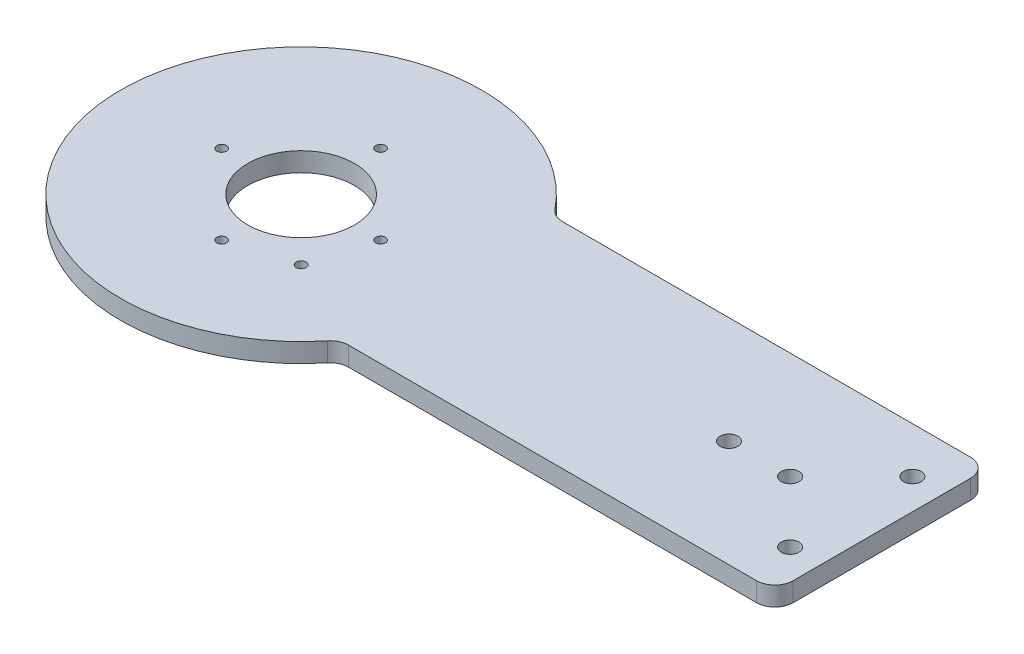
ISO-10303-21;
HEADER;
FILE_DESCRIPTION(('STEP AP214'),'2;1');
FILE_NAME('part.step','',(''),(''),'','','');
FILE_SCHEMA(('AUTOMOTIVE_DESIGN { 1 0 10303 214 1 1 1 1 }'));
ENDSEC;
DATA;
#1=APPLICATION_CONTEXT('core data for automotive mechanical design processes');
#2=APPLICATION_PROTOCOL_DEFINITION('international standard','automotive_design',2000,#1);
#3=PRODUCT_CONTEXT('',#1,'mechanical');
#4=PRODUCT('Part','Part','',(#3));
#5=PRODUCT_RELATED_PRODUCT_CATEGORY('part','',(#4));
#6=PRODUCT_DEFINITION_FORMATION('','',#4);
#7=PRODUCT_DEFINITION_CONTEXT('part definition',#1,'design');
#8=PRODUCT_DEFINITION('design','',#6,#7);
#9=PRODUCT_DEFINITION_SHAPE('','',#8);
#10=(LENGTH_UNIT() NAMED_UNIT(*) SI_UNIT(.MILLI.,.METRE.));
#11=(NAMED_UNIT(*) PLANE_ANGLE_UNIT() SI_UNIT($,.RADIAN.));
#12=(NAMED_UNIT(*) SI_UNIT($,.STERADIAN.) SOLID_ANGLE_UNIT());
#13=UNCERTAINTY_MEASURE_WITH_UNIT(LENGTH_MEASURE(1.E-05),#10,'distance_accuracy_value','');
#14=(GEOMETRIC_REPRESENTATION_CONTEXT(3) GLOBAL_UNCERTAINTY_ASSIGNED_CONTEXT((#13)) GLOBAL_UNIT_ASSIGNED_CONTEXT((#10,
#11,#12)) REPRESENTATION_CONTEXT('',''));
#15=CARTESIAN_POINT('',(0.,0.,0.));
#16=DIRECTION('',(0.,0.,1.));
#17=DIRECTION('',(1.,0.,0.));
#18=AXIS2_PLACEMENT_3D('',#15,#16,#17);
#19=CARTESIAN_POINT('',(0.,7.9375,0.));
#20=DIRECTION('',(0.,-1.,0.));
#21=DIRECTION('',(0.,0.,-1.));
#22=AXIS2_PLACEMENT_3D('',#19,#20,#21);
#23=CYLINDRICAL_SURFACE('',#22,75.00112);
#24=CARTESIAN_POINT('',(0.,0.,0.));
#25=DIRECTION('',(0.,1.,0.));
#26=DIRECTION('',(0.,0.,1.));
#27=AXIS2_PLACEMENT_3D('',#24,#25,#26);
#28=CIRCLE('',#27,75.00112);
#29=CARTESIAN_POINT('',(58.2317337981238,0.,-47.2676758484997));
#30=VERTEX_POINT('',#29);
#31=CARTESIAN_POINT('',(58.2317337981238,0.,47.2676758484998));
#32=VERTEX_POINT('',#31);
#33=EDGE_CURVE('E130',#30,#32,#28,.T.);
#34=ORIENTED_EDGE('',*,*,#33,.T.);
#35=DIRECTION('',(0.,-1.,0.));
#36=VECTOR('',#35,1.);
#37=CARTESIAN_POINT('',(58.2317337981238,7.9375,47.2676758484998));
#38=LINE('',#37,#36);
#39=CARTESIAN_POINT('',(58.2317337981238,7.9375,47.2676758484998));
#40=VERTEX_POINT('',#39);
#41=EDGE_CURVE('E150',#32,#40,#38,.F.);
#42=ORIENTED_EDGE('',*,*,#41,.T.);
#43=CARTESIAN_POINT('',(0.,7.9375,0.));
#44=DIRECTION('',(0.,1.,0.));
#45=DIRECTION('',(0.,0.,1.));
#46=AXIS2_PLACEMENT_3D('',#43,#44,#45);
#47=CIRCLE('',#46,75.00112);
#48=CARTESIAN_POINT('',(58.2317337981238,7.9375,-47.2676758484997));
#49=VERTEX_POINT('',#48);
#50=EDGE_CURVE('E128',#49,#40,#47,.T.);
#51=ORIENTED_EDGE('',*,*,#50,.F.);
#52=DIRECTION('',(0.,-1.,0.));
#53=VECTOR('',#52,1.);
#54=CARTESIAN_POINT('',(58.2317337981238,7.9375,-47.2676758484997));
#55=LINE('',#54,#53);
#56=EDGE_CURVE('E147',#49,#30,#55,.T.);
#57=ORIENTED_EDGE('',*,*,#56,.T.);
#58=EDGE_LOOP('',(#34,#42,#51,#57));
#59=FACE_BOUND('',#58,.T.);
#60=ADVANCED_FACE('F35',(#59),#23,.T.);
#61=CARTESIAN_POINT('',(241.3,7.9375,44.45));
#62=DIRECTION('',(0.,0.,-1.));
#63=DIRECTION('',(-1.,0.,0.));
#64=AXIS2_PLACEMENT_3D('',#61,#62,#63);
#65=PLANE('',#64);
#66=DIRECTION('',(1.,0.,0.));
#67=VECTOR('',#66,1.);
#68=CARTESIAN_POINT('',(241.3,0.,44.45));
#69=LINE('',#68,#67);
#70=CARTESIAN_POINT('',(64.1479896025931,0.,44.45));
#71=VERTEX_POINT('',#70);
#72=CARTESIAN_POINT('',(233.68,0.,44.45));
#73=VERTEX_POINT('',#72);
#74=EDGE_CURVE('E126',#71,#73,#69,.T.);
#75=ORIENTED_EDGE('',*,*,#74,.T.);
#76=DIRECTION('',(0.,-1.,0.));
#77=VECTOR('',#76,1.);
#78=CARTESIAN_POINT('',(233.68,7.9375,44.45));
#79=LINE('',#78,#77);
#80=CARTESIAN_POINT('',(233.68,7.9375,44.45));
#81=VERTEX_POINT('',#80);
#82=EDGE_CURVE('E106',#73,#81,#79,.F.);
#83=ORIENTED_EDGE('',*,*,#82,.T.);
#84=DIRECTION('',(1.,0.,0.));
#85=VECTOR('',#84,1.);
#86=CARTESIAN_POINT('',(241.3,7.9375,44.45));
#87=LINE('',#86,#85);
#88=CARTESIAN_POINT('',(64.1479896025931,7.9375,44.45));
#89=VERTEX_POINT('',#88);
#90=EDGE_CURVE('E169',#89,#81,#87,.T.);
#91=ORIENTED_EDGE('',*,*,#90,.F.);
#92=DIRECTION('',(0.,1.,0.));
#93=VECTOR('',#92,1.);
#94=CARTESIAN_POINT('',(64.1479896025931,0.,44.45));
#95=LINE('',#94,#93);
#96=EDGE_CURVE('E111',#89,#71,#95,.F.);
#97=ORIENTED_EDGE('',*,*,#96,.T.);
#98=EDGE_LOOP('',(#75,#83,#91,#97));
#99=FACE_BOUND('',#98,.T.);
#100=ADVANCED_FACE('F277',(#99),#65,.F.);
#101=CARTESIAN_POINT('',(241.3,7.9375,-44.45));
#102=DIRECTION('',(-1.,0.,0.));
#103=DIRECTION('',(0.,0.,1.));
#104=AXIS2_PLACEMENT_3D('',#101,#102,#103);
#105=PLANE('',#104);
#106=DIRECTION('',(0.,0.,-1.));
#107=VECTOR('',#106,1.);
#108=CARTESIAN_POINT('',(241.3,7.9375,-44.45));
#109=LINE('',#108,#107);
#110=CARTESIAN_POINT('',(241.3,7.9375,36.83));
#111=VERTEX_POINT('',#110);
#112=CARTESIAN_POINT('',(241.3,7.9375,-36.83));
#113=VERTEX_POINT('',#112);
#114=EDGE_CURVE('E120',#111,#113,#109,.T.);
#115=ORIENTED_EDGE('',*,*,#114,.F.);
#116=DIRECTION('',(0.,-1.,0.));
#117=VECTOR('',#116,1.);
#118=CARTESIAN_POINT('',(241.3,7.9375,36.83));
#119=LINE('',#118,#117);
#120=CARTESIAN_POINT('',(241.3,0.,36.83));
#121=VERTEX_POINT('',#120);
#122=EDGE_CURVE('E105',#111,#121,#119,.T.);
#123=ORIENTED_EDGE('',*,*,#122,.T.);
#124=DIRECTION('',(0.,0.,-1.));
#125=VECTOR('',#124,1.);
#126=CARTESIAN_POINT('',(241.3,0.,-44.45));
#127=LINE('',#126,#125);
#128=CARTESIAN_POINT('',(241.3,0.,-36.83));
#129=VERTEX_POINT('',#128);
#130=EDGE_CURVE('E118',#121,#129,#127,.T.);
#131=ORIENTED_EDGE('',*,*,#130,.T.);
#132=DIRECTION('',(0.,-1.,0.));
#133=VECTOR('',#132,1.);
#134=CARTESIAN_POINT('',(241.3,7.9375,-36.83));
#135=LINE('',#134,#133);
#136=EDGE_CURVE('E121',#129,#113,#135,.F.);
#137=ORIENTED_EDGE('',*,*,#136,.T.);
#138=EDGE_LOOP('',(#115,#123,#131,#137));
#139=FACE_BOUND('',#138,.T.);
#140=ADVANCED_FACE('F117',(#139),#105,.F.);
#141=CARTESIAN_POINT('',(241.3,7.9375,-44.45));
#142=DIRECTION('',(0.,0.,1.));
#143=DIRECTION('',(1.,0.,0.));
#144=AXIS2_PLACEMENT_3D('',#141,#142,#143);
#145=PLANE('',#144);
#146=DIRECTION('',(-1.,0.,0.));
#147=VECTOR('',#146,1.);
#148=CARTESIAN_POINT('',(241.3,7.9375,-44.45));
#149=LINE('',#148,#147);
#150=CARTESIAN_POINT('',(233.68,7.9375,-44.45));
#151=VERTEX_POINT('',#150);
#152=CARTESIAN_POINT('',(64.1479896025932,7.9375,-44.45));
#153=VERTEX_POINT('',#152);
#154=EDGE_CURVE('E134',#151,#153,#149,.T.);
#155=ORIENTED_EDGE('',*,*,#154,.F.);
#156=DIRECTION('',(0.,-1.,0.));
#157=VECTOR('',#156,1.);
#158=CARTESIAN_POINT('',(233.68,7.9375,-44.45));
#159=LINE('',#158,#157);
#160=CARTESIAN_POINT('',(233.68,0.,-44.45));
#161=VERTEX_POINT('',#160);
#162=EDGE_CURVE('E144',#151,#161,#159,.T.);
#163=ORIENTED_EDGE('',*,*,#162,.T.);
#164=DIRECTION('',(-1.,0.,0.));
#165=VECTOR('',#164,1.);
#166=CARTESIAN_POINT('',(241.3,0.,-44.45));
#167=LINE('',#166,#165);
#168=CARTESIAN_POINT('',(64.1479896025932,0.,-44.45));
#169=VERTEX_POINT('',#168);
#170=EDGE_CURVE('E125',#161,#169,#167,.T.);
#171=ORIENTED_EDGE('',*,*,#170,.T.);
#172=DIRECTION('',(0.,1.,0.));
#173=VECTOR('',#172,1.);
#174=CARTESIAN_POINT('',(64.1479896025932,7.9375,-44.45));
#175=LINE('',#174,#173);
#176=EDGE_CURVE('E50',#169,#153,#175,.T.);
#177=ORIENTED_EDGE('',*,*,#176,.T.);
#178=EDGE_LOOP('',(#155,#163,#171,#177));
#179=FACE_BOUND('',#178,.T.);
#180=ADVANCED_FACE('F159',(#179),#145,.F.);
#181=CARTESIAN_POINT('',(0.,7.9375,0.));
#182=DIRECTION('',(0.,1.,0.));
#183=DIRECTION('',(0.,0.,1.));
#184=AXIS2_PLACEMENT_3D('',#181,#182,#183);
#185=PLANE('',#184);
#186=CARTESIAN_POINT('',(228.6,7.9375,-25.4));
#187=DIRECTION('',(0.,1.,0.));
#188=DIRECTION('',(0.,0.,1.));
#189=AXIS2_PLACEMENT_3D('',#186,#187,#188);
#190=CIRCLE('',#189,3.68299999999999);
#191=CARTESIAN_POINT('',(228.6,7.9375,-21.717));
#192=VERTEX_POINT('',#191);
#193=EDGE_CURVE('E234',#192,#192,#190,.T.);
#194=ORIENTED_EDGE('',*,*,#193,.F.);
#195=EDGE_LOOP('',(#194));
#196=FACE_BOUND('',#195,.T.);
#197=CARTESIAN_POINT('',(228.6,7.9375,25.4));
#198=DIRECTION('',(0.,1.,0.));
#199=DIRECTION('',(0.,0.,1.));
#200=AXIS2_PLACEMENT_3D('',#197,#198,#199);
#201=CIRCLE('',#200,3.68299999999999);
#202=CARTESIAN_POINT('',(228.6,7.9375,29.083));
#203=VERTEX_POINT('',#202);
#204=EDGE_CURVE('E228',#203,#203,#201,.T.);
#205=ORIENTED_EDGE('',*,*,#204,.F.);
#206=EDGE_LOOP('',(#205));
#207=FACE_BOUND('',#206,.T.);
#208=CARTESIAN_POINT('',(203.2,7.9375,0.));
#209=DIRECTION('',(0.,1.,0.));
#210=DIRECTION('',(0.,0.,1.));
#211=AXIS2_PLACEMENT_3D('',#208,#209,#210);
#212=CIRCLE('',#211,3.68299999999999);
#213=CARTESIAN_POINT('',(203.2,7.9375,3.68299999999999));
#214=VERTEX_POINT('',#213);
#215=EDGE_CURVE('E222',#214,#214,#212,.T.);
#216=ORIENTED_EDGE('',*,*,#215,.F.);
#217=EDGE_LOOP('',(#216));
#218=FACE_BOUND('',#217,.T.);
#219=CARTESIAN_POINT('',(177.8,7.9375,0.));
#220=DIRECTION('',(0.,1.,0.));
#221=DIRECTION('',(0.,0.,1.));
#222=AXIS2_PLACEMENT_3D('',#219,#220,#221);
#223=CIRCLE('',#222,3.68299999999999);
#224=CARTESIAN_POINT('',(177.8,7.9375,3.68299999999999));
#225=VERTEX_POINT('',#224);
#226=EDGE_CURVE('E216',#225,#225,#223,.T.);
#227=ORIENTED_EDGE('',*,*,#226,.F.);
#228=EDGE_LOOP('',(#227));
#229=FACE_BOUND('',#228,.T.);
#230=CARTESIAN_POINT('',(25.4,7.9375,25.4));
#231=DIRECTION('',(0.,1.,0.));
#232=DIRECTION('',(0.,0.,1.));
#233=AXIS2_PLACEMENT_3D('',#230,#231,#232);
#234=CIRCLE('',#233,2.0193);
#235=CARTESIAN_POINT('',(25.4,7.9375,27.4193));
#236=VERTEX_POINT('',#235);
#237=EDGE_CURVE('E196',#236,#236,#234,.T.);
#238=ORIENTED_EDGE('',*,*,#237,.F.);
#239=EDGE_LOOP('',(#238));
#240=FACE_BOUND('',#239,.T.);
#241=CARTESIAN_POINT('',(33.02,7.9375,0.));
#242=DIRECTION('',(0.,1.,0.));
#243=DIRECTION('',(0.,0.,1.));
#244=AXIS2_PLACEMENT_3D('',#241,#242,#243);
#245=CIRCLE('',#244,2.0193);
#246=CARTESIAN_POINT('',(33.02,7.9375,2.0193));
#247=VERTEX_POINT('',#246);
#248=EDGE_CURVE('E203',#247,#247,#245,.T.);
#249=ORIENTED_EDGE('',*,*,#248,.F.);
#250=EDGE_LOOP('',(#249));
#251=FACE_BOUND('',#250,.T.);
#252=CARTESIAN_POINT('',(0.,7.9375,33.02));
#253=DIRECTION('',(0.,1.,0.));
#254=DIRECTION('',(0.,0.,1.));
#255=AXIS2_PLACEMENT_3D('',#252,#253,#254);
#256=CIRCLE('',#255,2.01930000000001);
#257=CARTESIAN_POINT('',(0.,7.9375,35.0393));
#258=VERTEX_POINT('',#257);
#259=EDGE_CURVE('E209',#258,#258,#256,.T.);
#260=ORIENTED_EDGE('',*,*,#259,.F.);
#261=EDGE_LOOP('',(#260));
#262=FACE_BOUND('',#261,.T.);
#263=CARTESIAN_POINT('',(-33.02,7.9375,0.));
#264=DIRECTION('',(0.,1.,0.));
#265=DIRECTION('',(0.,0.,1.));
#266=AXIS2_PLACEMENT_3D('',#263,#264,#265);
#267=CIRCLE('',#266,2.01930000000001);
#268=CARTESIAN_POINT('',(-33.02,7.9375,2.01930000000001));
#269=VERTEX_POINT('',#268);
#270=EDGE_CURVE('E184',#269,#269,#267,.T.);
#271=ORIENTED_EDGE('',*,*,#270,.F.);
#272=EDGE_LOOP('',(#271));
#273=FACE_BOUND('',#272,.T.);
#274=CARTESIAN_POINT('',(0.,7.9375,-33.02));
#275=DIRECTION('',(0.,1.,0.));
#276=DIRECTION('',(0.,0.,1.));
#277=AXIS2_PLACEMENT_3D('',#274,#275,#276);
#278=CIRCLE('',#277,2.01930000000001);
#279=CARTESIAN_POINT('',(0.,7.9375,-31.0007));
#280=VERTEX_POINT('',#279);
#281=EDGE_CURVE('E191',#280,#280,#278,.T.);
#282=ORIENTED_EDGE('',*,*,#281,.F.);
#283=EDGE_LOOP('',(#282));
#284=FACE_BOUND('',#283,.T.);
#285=CARTESIAN_POINT('',(0.,7.9375,0.));
#286=DIRECTION('',(0.,1.,0.));
#287=DIRECTION('',(0.,0.,1.));
#288=AXIS2_PLACEMENT_3D('',#285,#286,#287);
#289=CIRCLE('',#288,22.1615);
#290=CARTESIAN_POINT('',(0.,7.9375,22.1615));
#291=VERTEX_POINT('',#290);
#292=EDGE_CURVE('E173',#291,#291,#289,.T.);
#293=ORIENTED_EDGE('',*,*,#292,.F.);
#294=EDGE_LOOP('',(#293));
#295=FACE_BOUND('',#294,.T.);
#296=ORIENTED_EDGE('',*,*,#90,.T.);
#297=CARTESIAN_POINT('',(233.68,7.9375,36.83));
#298=DIRECTION('',(0.,1.,0.));
#299=DIRECTION('',(0.,0.,1.));
#300=AXIS2_PLACEMENT_3D('',#297,#298,#299);
#301=CIRCLE('',#300,7.62);
#302=EDGE_CURVE('E141',#81,#111,#301,.T.);
#303=ORIENTED_EDGE('',*,*,#302,.T.);
#304=ORIENTED_EDGE('',*,*,#114,.T.);
#305=CARTESIAN_POINT('',(233.68,7.9375,-36.83));
#306=DIRECTION('',(0.,1.,0.));
#307=DIRECTION('',(0.,0.,1.));
#308=AXIS2_PLACEMENT_3D('',#305,#306,#307);
#309=CIRCLE('',#308,7.62);
#310=EDGE_CURVE('E57',#113,#151,#309,.T.);
#311=ORIENTED_EDGE('',*,*,#310,.T.);
#312=ORIENTED_EDGE('',*,*,#154,.T.);
#313=CARTESIAN_POINT('',(64.1479896025932,7.9375,-52.07));
#314=DIRECTION('',(0.,1.,0.));
#315=DIRECTION('',(0.,0.,1.));
#316=AXIS2_PLACEMENT_3D('',#313,#314,#315);
#317=CIRCLE('',#316,7.62);
#318=EDGE_CURVE('E11',#153,#49,#317,.F.);
#319=ORIENTED_EDGE('',*,*,#318,.T.);
#320=ORIENTED_EDGE('',*,*,#50,.T.);
#321=CARTESIAN_POINT('',(64.1479896025931,7.9375,52.07));
#322=DIRECTION('',(0.,1.,0.));
#323=DIRECTION('',(0.,0.,1.));
#324=AXIS2_PLACEMENT_3D('',#321,#322,#323);
#325=CIRCLE('',#324,7.62);
#326=EDGE_CURVE('E154',#40,#89,#325,.F.);
#327=ORIENTED_EDGE('',*,*,#326,.T.);
#328=EDGE_LOOP('',(#296,#303,#304,#311,#312,#319,#320,#327));
#329=FACE_BOUND('',#328,.T.);
#330=ADVANCED_FACE('F165',(#196,#207,#218,#229,#240,#251,#262,#273,#284,#295,#329),#185,.T.);
#331=CARTESIAN_POINT('',(0.,0.,0.));
#332=DIRECTION('',(0.,1.,0.));
#333=DIRECTION('',(0.,0.,1.));
#334=AXIS2_PLACEMENT_3D('',#331,#332,#333);
#335=PLANE('',#334);
#336=CARTESIAN_POINT('',(228.6,0.,-25.4));
#337=DIRECTION('',(0.,1.,0.));
#338=DIRECTION('',(0.,0.,1.));
#339=AXIS2_PLACEMENT_3D('',#336,#337,#338);
#340=CIRCLE('',#339,3.68299999999999);
#341=CARTESIAN_POINT('',(228.6,0.,-21.717));
#342=VERTEX_POINT('',#341);
#343=EDGE_CURVE('E231',#342,#342,#340,.T.);
#344=ORIENTED_EDGE('',*,*,#343,.T.);
#345=EDGE_LOOP('',(#344));
#346=FACE_BOUND('',#345,.T.);
#347=CARTESIAN_POINT('',(228.6,0.,25.4));
#348=DIRECTION('',(0.,1.,0.));
#349=DIRECTION('',(0.,0.,1.));
#350=AXIS2_PLACEMENT_3D('',#347,#348,#349);
#351=CIRCLE('',#350,3.68299999999999);
#352=CARTESIAN_POINT('',(228.6,0.,29.083));
#353=VERTEX_POINT('',#352);
#354=EDGE_CURVE('E225',#353,#353,#351,.T.);
#355=ORIENTED_EDGE('',*,*,#354,.T.);
#356=EDGE_LOOP('',(#355));
#357=FACE_BOUND('',#356,.T.);
#358=CARTESIAN_POINT('',(203.2,0.,0.));
#359=DIRECTION('',(0.,1.,0.));
#360=DIRECTION('',(0.,0.,1.));
#361=AXIS2_PLACEMENT_3D('',#358,#359,#360);
#362=CIRCLE('',#361,3.68299999999999);
#363=CARTESIAN_POINT('',(203.2,0.,3.68299999999999));
#364=VERTEX_POINT('',#363);
#365=EDGE_CURVE('E219',#364,#364,#362,.T.);
#366=ORIENTED_EDGE('',*,*,#365,.T.);
#367=EDGE_LOOP('',(#366));
#368=FACE_BOUND('',#367,.T.);
#369=CARTESIAN_POINT('',(177.8,0.,0.));
#370=DIRECTION('',(0.,1.,0.));
#371=DIRECTION('',(0.,0.,1.));
#372=AXIS2_PLACEMENT_3D('',#369,#370,#371);
#373=CIRCLE('',#372,3.68299999999999);
#374=CARTESIAN_POINT('',(177.8,0.,3.68299999999999));
#375=VERTEX_POINT('',#374);
#376=EDGE_CURVE('E200',#375,#375,#373,.T.);
#377=ORIENTED_EDGE('',*,*,#376,.T.);
#378=EDGE_LOOP('',(#377));
#379=FACE_BOUND('',#378,.T.);
#380=CARTESIAN_POINT('',(25.4,0.,25.4));
#381=DIRECTION('',(0.,1.,0.));
#382=DIRECTION('',(0.,0.,1.));
#383=AXIS2_PLACEMENT_3D('',#380,#381,#382);
#384=CIRCLE('',#383,2.0193);
#385=CARTESIAN_POINT('',(25.4,0.,27.4193));
#386=VERTEX_POINT('',#385);
#387=EDGE_CURVE('E199',#386,#386,#384,.T.);
#388=ORIENTED_EDGE('',*,*,#387,.T.);
#389=EDGE_LOOP('',(#388));
#390=FACE_BOUND('',#389,.T.);
#391=CARTESIAN_POINT('',(33.02,0.,0.));
#392=DIRECTION('',(0.,1.,0.));
#393=DIRECTION('',(0.,0.,1.));
#394=AXIS2_PLACEMENT_3D('',#391,#392,#393);
#395=CIRCLE('',#394,2.0193);
#396=CARTESIAN_POINT('',(33.02,0.,2.0193));
#397=VERTEX_POINT('',#396);
#398=EDGE_CURVE('E206',#397,#397,#395,.T.);
#399=ORIENTED_EDGE('',*,*,#398,.T.);
#400=EDGE_LOOP('',(#399));
#401=FACE_BOUND('',#400,.T.);
#402=CARTESIAN_POINT('',(0.,0.,33.02));
#403=DIRECTION('',(0.,1.,0.));
#404=DIRECTION('',(0.,0.,1.));
#405=AXIS2_PLACEMENT_3D('',#402,#403,#404);
#406=CIRCLE('',#405,2.01930000000001);
#407=CARTESIAN_POINT('',(0.,0.,35.0393));
#408=VERTEX_POINT('',#407);
#409=EDGE_CURVE('E188',#408,#408,#406,.T.);
#410=ORIENTED_EDGE('',*,*,#409,.T.);
#411=EDGE_LOOP('',(#410));
#412=FACE_BOUND('',#411,.T.);
#413=CARTESIAN_POINT('',(-33.02,0.,0.));
#414=DIRECTION('',(0.,1.,0.));
#415=DIRECTION('',(0.,0.,1.));
#416=AXIS2_PLACEMENT_3D('',#413,#414,#415);
#417=CIRCLE('',#416,2.01930000000001);
#418=CARTESIAN_POINT('',(-33.02,0.,2.01930000000001));
#419=VERTEX_POINT('',#418);
#420=EDGE_CURVE('E187',#419,#419,#417,.T.);
#421=ORIENTED_EDGE('',*,*,#420,.T.);
#422=EDGE_LOOP('',(#421));
#423=FACE_BOUND('',#422,.T.);
#424=CARTESIAN_POINT('',(0.,0.,-33.02));
#425=DIRECTION('',(0.,1.,0.));
#426=DIRECTION('',(0.,0.,1.));
#427=AXIS2_PLACEMENT_3D('',#424,#425,#426);
#428=CIRCLE('',#427,2.01930000000001);
#429=CARTESIAN_POINT('',(0.,0.,-31.0007));
#430=VERTEX_POINT('',#429);
#431=EDGE_CURVE('E182',#430,#430,#428,.T.);
#432=ORIENTED_EDGE('',*,*,#431,.T.);
#433=EDGE_LOOP('',(#432));
#434=FACE_BOUND('',#433,.T.);
#435=CARTESIAN_POINT('',(0.,0.,0.));
#436=DIRECTION('',(0.,1.,0.));
#437=DIRECTION('',(0.,0.,1.));
#438=AXIS2_PLACEMENT_3D('',#435,#436,#437);
#439=CIRCLE('',#438,22.1615);
#440=CARTESIAN_POINT('',(0.,0.,22.1615));
#441=VERTEX_POINT('',#440);
#442=EDGE_CURVE('E177',#441,#441,#439,.T.);
#443=ORIENTED_EDGE('',*,*,#442,.T.);
#444=EDGE_LOOP('',(#443));
#445=FACE_BOUND('',#444,.T.);
#446=ORIENTED_EDGE('',*,*,#130,.F.);
#447=CARTESIAN_POINT('',(233.68,0.,36.83));
#448=DIRECTION('',(0.,1.,0.));
#449=DIRECTION('',(0.,0.,1.));
#450=AXIS2_PLACEMENT_3D('',#447,#448,#449);
#451=CIRCLE('',#450,7.62);
#452=EDGE_CURVE('E101',#121,#73,#451,.F.);
#453=ORIENTED_EDGE('',*,*,#452,.T.);
#454=ORIENTED_EDGE('',*,*,#74,.F.);
#455=CARTESIAN_POINT('',(64.1479896025931,0.,52.07));
#456=DIRECTION('',(0.,1.,0.));
#457=DIRECTION('',(0.,0.,1.));
#458=AXIS2_PLACEMENT_3D('',#455,#456,#457);
#459=CIRCLE('',#458,7.62);
#460=EDGE_CURVE('E152',#71,#32,#459,.T.);
#461=ORIENTED_EDGE('',*,*,#460,.T.);
#462=ORIENTED_EDGE('',*,*,#33,.F.);
#463=CARTESIAN_POINT('',(64.1479896025932,0.,-52.07));
#464=DIRECTION('',(0.,1.,0.));
#465=DIRECTION('',(0.,0.,1.));
#466=AXIS2_PLACEMENT_3D('',#463,#464,#465);
#467=CIRCLE('',#466,7.62);
#468=EDGE_CURVE('E43',#30,#169,#467,.T.);
#469=ORIENTED_EDGE('',*,*,#468,.T.);
#470=ORIENTED_EDGE('',*,*,#170,.F.);
#471=CARTESIAN_POINT('',(233.68,0.,-36.83));
#472=DIRECTION('',(0.,1.,0.));
#473=DIRECTION('',(0.,0.,1.));
#474=AXIS2_PLACEMENT_3D('',#471,#472,#473);
#475=CIRCLE('',#474,7.62);
#476=EDGE_CURVE('E112',#161,#129,#475,.F.);
#477=ORIENTED_EDGE('',*,*,#476,.T.);
#478=EDGE_LOOP('',(#446,#453,#454,#461,#462,#469,#470,#477));
#479=FACE_BOUND('',#478,.T.);
#480=ADVANCED_FACE('F123',(#346,#357,#368,#379,#390,#401,#412,#423,#434,#445,#479),#335,.F.);
#481=CARTESIAN_POINT('',(0.,0.,0.));
#482=DIRECTION('',(0.,1.,0.));
#483=DIRECTION('',(0.,0.,1.));
#484=AXIS2_PLACEMENT_3D('',#481,#482,#483);
#485=CYLINDRICAL_SURFACE('',#484,22.1615);
#486=ORIENTED_EDGE('',*,*,#442,.F.);
#487=EDGE_LOOP('',(#486));
#488=FACE_BOUND('',#487,.T.);
#489=ORIENTED_EDGE('',*,*,#292,.T.);
#490=EDGE_LOOP('',(#489));
#491=FACE_BOUND('',#490,.T.);
#492=ADVANCED_FACE('F261',(#488,#491),#485,.F.);
#493=CARTESIAN_POINT('',(0.,0.,-33.02));
#494=DIRECTION('',(0.,1.,0.));
#495=DIRECTION('',(0.,0.,1.));
#496=AXIS2_PLACEMENT_3D('',#493,#494,#495);
#497=CYLINDRICAL_SURFACE('',#496,2.01930000000001);
#498=ORIENTED_EDGE('',*,*,#431,.F.);
#499=EDGE_LOOP('',(#498));
#500=FACE_BOUND('',#499,.T.);
#501=ORIENTED_EDGE('',*,*,#281,.T.);
#502=EDGE_LOOP('',(#501));
#503=FACE_BOUND('',#502,.T.);
#504=ADVANCED_FACE('F263',(#500,#503),#497,.F.);
#505=CARTESIAN_POINT('',(-33.02,0.,0.));
#506=DIRECTION('',(0.,1.,0.));
#507=DIRECTION('',(0.,0.,1.));
#508=AXIS2_PLACEMENT_3D('',#505,#506,#507);
#509=CYLINDRICAL_SURFACE('',#508,2.01930000000001);
#510=ORIENTED_EDGE('',*,*,#420,.F.);
#511=EDGE_LOOP('',(#510));
#512=FACE_BOUND('',#511,.T.);
#513=ORIENTED_EDGE('',*,*,#270,.T.);
#514=EDGE_LOOP('',(#513));
#515=FACE_BOUND('',#514,.T.);
#516=ADVANCED_FACE('F270',(#512,#515),#509,.F.);
#517=CARTESIAN_POINT('',(0.,0.,33.02));
#518=DIRECTION('',(0.,1.,0.));
#519=DIRECTION('',(0.,0.,1.));
#520=AXIS2_PLACEMENT_3D('',#517,#518,#519);
#521=CYLINDRICAL_SURFACE('',#520,2.01930000000001);
#522=ORIENTED_EDGE('',*,*,#409,.F.);
#523=EDGE_LOOP('',(#522));
#524=FACE_BOUND('',#523,.T.);
#525=ORIENTED_EDGE('',*,*,#259,.T.);
#526=EDGE_LOOP('',(#525));
#527=FACE_BOUND('',#526,.T.);
#528=ADVANCED_FACE('F317',(#524,#527),#521,.F.);
#529=CARTESIAN_POINT('',(33.02,0.,0.));
#530=DIRECTION('',(0.,1.,0.));
#531=DIRECTION('',(0.,0.,1.));
#532=AXIS2_PLACEMENT_3D('',#529,#530,#531);
#533=CYLINDRICAL_SURFACE('',#532,2.0193);
#534=ORIENTED_EDGE('',*,*,#398,.F.);
#535=EDGE_LOOP('',(#534));
#536=FACE_BOUND('',#535,.T.);
#537=ORIENTED_EDGE('',*,*,#248,.T.);
#538=EDGE_LOOP('',(#537));
#539=FACE_BOUND('',#538,.T.);
#540=ADVANCED_FACE('F320',(#536,#539),#533,.F.);
#541=CARTESIAN_POINT('',(25.4,0.,25.4));
#542=DIRECTION('',(0.,1.,0.));
#543=DIRECTION('',(0.,0.,1.));
#544=AXIS2_PLACEMENT_3D('',#541,#542,#543);
#545=CYLINDRICAL_SURFACE('',#544,2.0193);
#546=ORIENTED_EDGE('',*,*,#387,.F.);
#547=EDGE_LOOP('',(#546));
#548=FACE_BOUND('',#547,.T.);
#549=ORIENTED_EDGE('',*,*,#237,.T.);
#550=EDGE_LOOP('',(#549));
#551=FACE_BOUND('',#550,.T.);
#552=ADVANCED_FACE('F289',(#548,#551),#545,.F.);
#553=CARTESIAN_POINT('',(233.68,7.9375,36.83));
#554=DIRECTION('',(0.,-1.,0.));
#555=DIRECTION('',(0.,0.,-1.));
#556=AXIS2_PLACEMENT_3D('',#553,#554,#555);
#557=CYLINDRICAL_SURFACE('',#556,7.62);
#558=ORIENTED_EDGE('',*,*,#302,.F.);
#559=ORIENTED_EDGE('',*,*,#82,.F.);
#560=ORIENTED_EDGE('',*,*,#452,.F.);
#561=ORIENTED_EDGE('',*,*,#122,.F.);
#562=EDGE_LOOP('',(#558,#559,#560,#561));
#563=FACE_BOUND('',#562,.T.);
#564=ADVANCED_FACE('F104',(#563),#557,.T.);
#565=CARTESIAN_POINT('',(233.68,7.9375,-36.83));
#566=DIRECTION('',(0.,-1.,0.));
#567=DIRECTION('',(0.,0.,-1.));
#568=AXIS2_PLACEMENT_3D('',#565,#566,#567);
#569=CYLINDRICAL_SURFACE('',#568,7.62);
#570=ORIENTED_EDGE('',*,*,#310,.F.);
#571=ORIENTED_EDGE('',*,*,#136,.F.);
#572=ORIENTED_EDGE('',*,*,#476,.F.);
#573=ORIENTED_EDGE('',*,*,#162,.F.);
#574=EDGE_LOOP('',(#570,#571,#572,#573));
#575=FACE_BOUND('',#574,.T.);
#576=ADVANCED_FACE('F288',(#575),#569,.T.);
#577=CARTESIAN_POINT('',(64.1479896025931,7.9375,52.07));
#578=DIRECTION('',(0.,-1.,0.));
#579=DIRECTION('',(0.,0.,-1.));
#580=AXIS2_PLACEMENT_3D('',#577,#578,#579);
#581=CYLINDRICAL_SURFACE('',#580,7.62);
#582=ORIENTED_EDGE('',*,*,#326,.F.);
#583=ORIENTED_EDGE('',*,*,#41,.F.);
#584=ORIENTED_EDGE('',*,*,#460,.F.);
#585=ORIENTED_EDGE('',*,*,#96,.F.);
#586=EDGE_LOOP('',(#582,#583,#584,#585));
#587=FACE_BOUND('',#586,.T.);
#588=ADVANCED_FACE('F291',(#587),#581,.F.);
#589=CARTESIAN_POINT('',(64.1479896025932,7.9375,-52.07));
#590=DIRECTION('',(0.,-1.,0.));
#591=DIRECTION('',(0.,0.,-1.));
#592=AXIS2_PLACEMENT_3D('',#589,#590,#591);
#593=CYLINDRICAL_SURFACE('',#592,7.62);
#594=ORIENTED_EDGE('',*,*,#318,.F.);
#595=ORIENTED_EDGE('',*,*,#176,.F.);
#596=ORIENTED_EDGE('',*,*,#468,.F.);
#597=ORIENTED_EDGE('',*,*,#56,.F.);
#598=EDGE_LOOP('',(#594,#595,#596,#597));
#599=FACE_BOUND('',#598,.T.);
#600=ADVANCED_FACE('F37',(#599),#593,.F.);
#601=CARTESIAN_POINT('',(177.8,7.9375,0.));
#602=DIRECTION('',(0.,1.,0.));
#603=DIRECTION('',(0.,0.,1.));
#604=AXIS2_PLACEMENT_3D('',#601,#602,#603);
#605=CYLINDRICAL_SURFACE('',#604,3.68299999999999);
#606=ORIENTED_EDGE('',*,*,#376,.F.);
#607=EDGE_LOOP('',(#606));
#608=FACE_BOUND('',#607,.T.);
#609=ORIENTED_EDGE('',*,*,#226,.T.);
#610=EDGE_LOOP('',(#609));
#611=FACE_BOUND('',#610,.T.);
#612=ADVANCED_FACE('F298',(#608,#611),#605,.F.);
#613=CARTESIAN_POINT('',(203.2,7.9375,0.));
#614=DIRECTION('',(0.,1.,0.));
#615=DIRECTION('',(0.,0.,1.));
#616=AXIS2_PLACEMENT_3D('',#613,#614,#615);
#617=CYLINDRICAL_SURFACE('',#616,3.68299999999999);
#618=ORIENTED_EDGE('',*,*,#365,.F.);
#619=EDGE_LOOP('',(#618));
#620=FACE_BOUND('',#619,.T.);
#621=ORIENTED_EDGE('',*,*,#215,.T.);
#622=EDGE_LOOP('',(#621));
#623=FACE_BOUND('',#622,.T.);
#624=ADVANCED_FACE('F304',(#620,#623),#617,.F.);
#625=CARTESIAN_POINT('',(228.6,7.9375,25.4));
#626=DIRECTION('',(0.,1.,0.));
#627=DIRECTION('',(0.,0.,1.));
#628=AXIS2_PLACEMENT_3D('',#625,#626,#627);
#629=CYLINDRICAL_SURFACE('',#628,3.68299999999999);
#630=ORIENTED_EDGE('',*,*,#354,.F.);
#631=EDGE_LOOP('',(#630));
#632=FACE_BOUND('',#631,.T.);
#633=ORIENTED_EDGE('',*,*,#204,.T.);
#634=EDGE_LOOP('',(#633));
#635=FACE_BOUND('',#634,.T.);
#636=ADVANCED_FACE('F310',(#632,#635),#629,.F.);
#637=CARTESIAN_POINT('',(228.6,7.9375,-25.4));
#638=DIRECTION('',(0.,1.,0.));
#639=DIRECTION('',(0.,0.,1.));
#640=AXIS2_PLACEMENT_3D('',#637,#638,#639);
#641=CYLINDRICAL_SURFACE('',#640,3.68299999999999);
#642=ORIENTED_EDGE('',*,*,#343,.F.);
#643=EDGE_LOOP('',(#642));
#644=FACE_BOUND('',#643,.T.);
#645=ORIENTED_EDGE('',*,*,#193,.T.);
#646=EDGE_LOOP('',(#645));
#647=FACE_BOUND('',#646,.T.);
#648=ADVANCED_FACE('F238',(#644,#647),#641,.F.);
#649=CLOSED_SHELL('',(#60,#100,#140,#180,#330,#480,#492,#504,#516,#528,#540,#552,#564,#576,#588,
#600,#612,#624,#636,#648));
#650=MANIFOLD_SOLID_BREP('B2',#649);
#651=ADVANCED_BREP_SHAPE_REPRESENTATION('',(#18,#650),#14);
#652=SHAPE_DEFINITION_REPRESENTATION(#9,#651);
ENDSEC;
END-ISO-10303-21;
